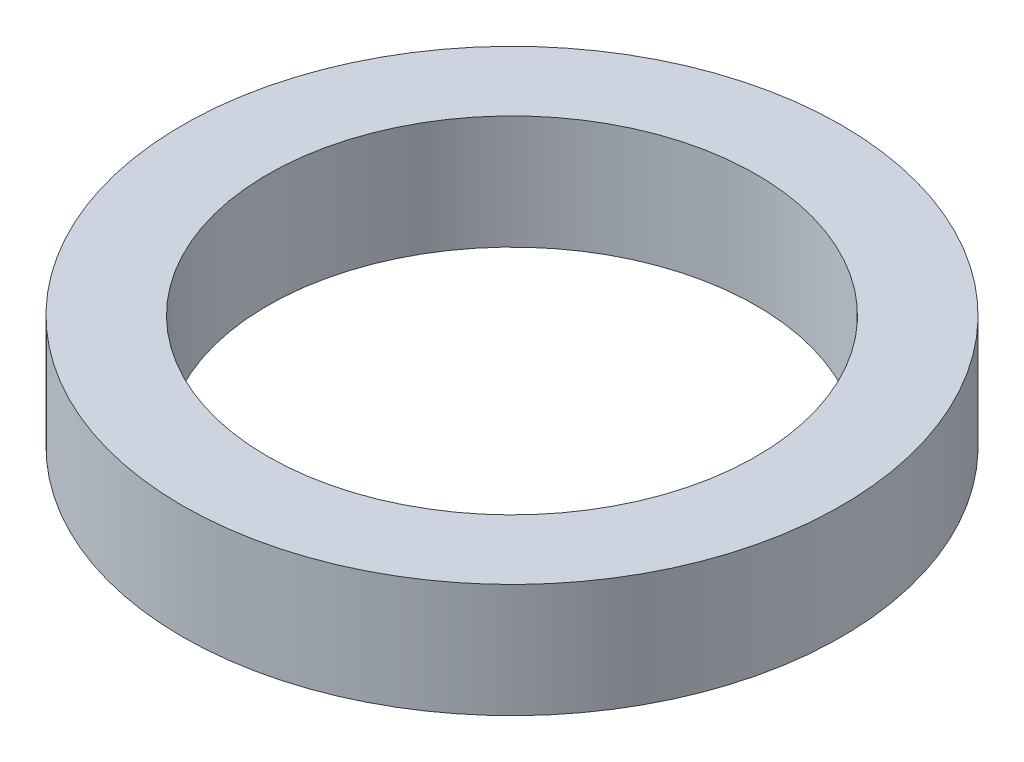
ISO-10303-21;
HEADER;
FILE_DESCRIPTION(('STEP AP214'),'2;1');
FILE_NAME('part.step','',(''),(''),'','','');
FILE_SCHEMA(('AUTOMOTIVE_DESIGN { 1 0 10303 214 1 1 1 1 }'));
ENDSEC;
DATA;
#1=APPLICATION_CONTEXT('core data for automotive mechanical design processes');
#2=APPLICATION_PROTOCOL_DEFINITION('international standard','automotive_design',2000,#1);
#3=PRODUCT_CONTEXT('',#1,'mechanical');
#4=PRODUCT('Part','Part','',(#3));
#5=PRODUCT_RELATED_PRODUCT_CATEGORY('part','',(#4));
#6=PRODUCT_DEFINITION_FORMATION('','',#4);
#7=PRODUCT_DEFINITION_CONTEXT('part definition',#1,'design');
#8=PRODUCT_DEFINITION('design','',#6,#7);
#9=PRODUCT_DEFINITION_SHAPE('','',#8);
#10=(LENGTH_UNIT() NAMED_UNIT(*) SI_UNIT(.MILLI.,.METRE.));
#11=(NAMED_UNIT(*) PLANE_ANGLE_UNIT() SI_UNIT($,.RADIAN.));
#12=(NAMED_UNIT(*) SI_UNIT($,.STERADIAN.) SOLID_ANGLE_UNIT());
#13=UNCERTAINTY_MEASURE_WITH_UNIT(LENGTH_MEASURE(1.E-05),#10,'distance_accuracy_value','');
#14=(GEOMETRIC_REPRESENTATION_CONTEXT(3) GLOBAL_UNCERTAINTY_ASSIGNED_CONTEXT((#13)) GLOBAL_UNIT_ASSIGNED_CONTEXT((#10,
#11,#12)) REPRESENTATION_CONTEXT('',''));
#15=CARTESIAN_POINT('',(0.,0.,0.));
#16=DIRECTION('',(0.,0.,1.));
#17=DIRECTION('',(1.,0.,0.));
#18=AXIS2_PLACEMENT_3D('',#15,#16,#17);
#19=CARTESIAN_POINT('',(0.,10.,0.));
#20=DIRECTION('',(0.,1.,0.));
#21=DIRECTION('',(0.,0.,1.));
#22=AXIS2_PLACEMENT_3D('',#19,#20,#21);
#23=PLANE('',#22);
#24=CARTESIAN_POINT('',(0.,10.,0.));
#25=DIRECTION('',(0.,1.,0.));
#26=DIRECTION('',(0.,0.,1.));
#27=AXIS2_PLACEMENT_3D('',#24,#25,#26);
#28=CIRCLE('',#27,29.);
#29=CARTESIAN_POINT('',(0.,10.,29.));
#30=VERTEX_POINT('',#29);
#31=EDGE_CURVE('E10',#30,#30,#28,.T.);
#32=ORIENTED_EDGE('',*,*,#31,.T.);
#33=EDGE_LOOP('',(#32));
#34=FACE_BOUND('',#33,.T.);
#35=CARTESIAN_POINT('',(0.,10.,0.));
#36=DIRECTION('',(0.,1.,0.));
#37=DIRECTION('',(0.,0.,1.));
#38=AXIS2_PLACEMENT_3D('',#35,#36,#37);
#39=CIRCLE('',#38,21.5);
#40=CARTESIAN_POINT('',(0.,10.,21.5));
#41=VERTEX_POINT('',#40);
#42=EDGE_CURVE('E43',#41,#41,#39,.T.);
#43=ORIENTED_EDGE('',*,*,#42,.F.);
#44=EDGE_LOOP('',(#43));
#45=FACE_BOUND('',#44,.T.);
#46=ADVANCED_FACE('F32',(#34,#45),#23,.T.);
#47=CARTESIAN_POINT('',(0.,0.,0.));
#48=DIRECTION('',(0.,1.,0.));
#49=DIRECTION('',(0.,0.,1.));
#50=AXIS2_PLACEMENT_3D('',#47,#48,#49);
#51=PLANE('',#50);
#52=CARTESIAN_POINT('',(0.,0.,0.));
#53=DIRECTION('',(0.,1.,0.));
#54=DIRECTION('',(0.,0.,1.));
#55=AXIS2_PLACEMENT_3D('',#52,#53,#54);
#56=CIRCLE('',#55,29.);
#57=CARTESIAN_POINT('',(0.,0.,29.));
#58=VERTEX_POINT('',#57);
#59=EDGE_CURVE('E36',#58,#58,#56,.T.);
#60=ORIENTED_EDGE('',*,*,#59,.F.);
#61=EDGE_LOOP('',(#60));
#62=FACE_BOUND('',#61,.T.);
#63=CARTESIAN_POINT('',(0.,0.,0.));
#64=DIRECTION('',(0.,1.,0.));
#65=DIRECTION('',(0.,0.,1.));
#66=AXIS2_PLACEMENT_3D('',#63,#64,#65);
#67=CIRCLE('',#66,21.5);
#68=CARTESIAN_POINT('',(0.,0.,21.5));
#69=VERTEX_POINT('',#68);
#70=EDGE_CURVE('E45',#69,#69,#67,.T.);
#71=ORIENTED_EDGE('',*,*,#70,.T.);
#72=EDGE_LOOP('',(#71));
#73=FACE_BOUND('',#72,.T.);
#74=ADVANCED_FACE('F55',(#62,#73),#51,.F.);
#75=CARTESIAN_POINT('',(0.,10.,0.));
#76=DIRECTION('',(0.,-1.,0.));
#77=DIRECTION('',(0.,0.,-1.));
#78=AXIS2_PLACEMENT_3D('',#75,#76,#77);
#79=CYLINDRICAL_SURFACE('',#78,29.);
#80=ORIENTED_EDGE('',*,*,#31,.F.);
#81=EDGE_LOOP('',(#80));
#82=FACE_BOUND('',#81,.T.);
#83=ORIENTED_EDGE('',*,*,#59,.T.);
#84=EDGE_LOOP('',(#83));
#85=FACE_BOUND('',#84,.T.);
#86=ADVANCED_FACE('F34',(#82,#85),#79,.T.);
#87=CARTESIAN_POINT('',(0.,10.,0.));
#88=DIRECTION('',(0.,-1.,0.));
#89=DIRECTION('',(0.,0.,-1.));
#90=AXIS2_PLACEMENT_3D('',#87,#88,#89);
#91=CYLINDRICAL_SURFACE('',#90,21.5);
#92=ORIENTED_EDGE('',*,*,#42,.T.);
#93=EDGE_LOOP('',(#92));
#94=FACE_BOUND('',#93,.T.);
#95=ORIENTED_EDGE('',*,*,#70,.F.);
#96=EDGE_LOOP('',(#95));
#97=FACE_BOUND('',#96,.T.);
#98=ADVANCED_FACE('F51',(#94,#97),#91,.F.);
#99=CLOSED_SHELL('',(#46,#74,#86,#98));
#100=MANIFOLD_SOLID_BREP('B2',#99);
#101=ADVANCED_BREP_SHAPE_REPRESENTATION('',(#18,#100),#14);
#102=SHAPE_DEFINITION_REPRESENTATION(#9,#101);
ENDSEC;
END-ISO-10303-21;
